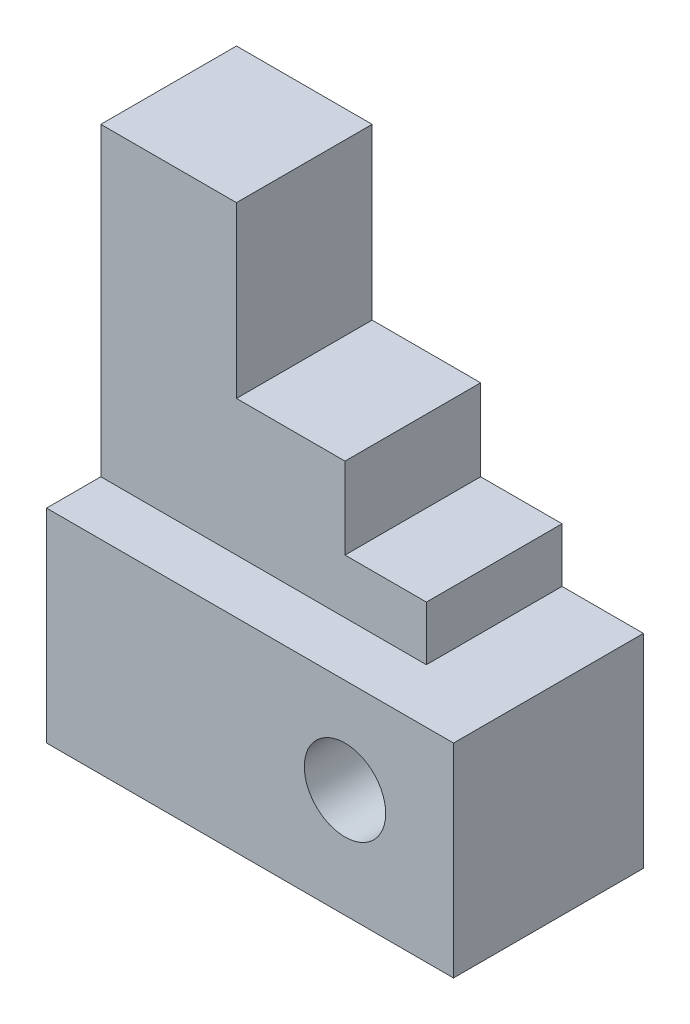
ISO-10303-21;
HEADER;
FILE_DESCRIPTION(('STEP AP214'),'2;1');
FILE_NAME('part.step','',(''),(''),'','','');
FILE_SCHEMA(('AUTOMOTIVE_DESIGN { 1 0 10303 214 1 1 1 1 }'));
ENDSEC;
DATA;
#1=APPLICATION_CONTEXT('core data for automotive mechanical design processes');
#2=APPLICATION_PROTOCOL_DEFINITION('international standard','automotive_design',2000,#1);
#3=PRODUCT_CONTEXT('',#1,'mechanical');
#4=PRODUCT('Part','Part','',(#3));
#5=PRODUCT_RELATED_PRODUCT_CATEGORY('part','',(#4));
#6=PRODUCT_DEFINITION_FORMATION('','',#4);
#7=PRODUCT_DEFINITION_CONTEXT('part definition',#1,'design');
#8=PRODUCT_DEFINITION('design','',#6,#7);
#9=PRODUCT_DEFINITION_SHAPE('','',#8);
#10=(LENGTH_UNIT() NAMED_UNIT(*) SI_UNIT(.MILLI.,.METRE.));
#11=(NAMED_UNIT(*) PLANE_ANGLE_UNIT() SI_UNIT($,.RADIAN.));
#12=(NAMED_UNIT(*) SI_UNIT($,.STERADIAN.) SOLID_ANGLE_UNIT());
#13=UNCERTAINTY_MEASURE_WITH_UNIT(LENGTH_MEASURE(1.E-05),#10,'distance_accuracy_value','');
#14=(GEOMETRIC_REPRESENTATION_CONTEXT(3) GLOBAL_UNCERTAINTY_ASSIGNED_CONTEXT((#13)) GLOBAL_UNIT_ASSIGNED_CONTEXT((#10,
#11,#12)) REPRESENTATION_CONTEXT('',''));
#15=CARTESIAN_POINT('',(0.,0.,0.));
#16=DIRECTION('',(0.,0.,1.));
#17=DIRECTION('',(1.,0.,0.));
#18=AXIS2_PLACEMENT_3D('',#15,#16,#17);
#19=CARTESIAN_POINT('',(0.,0.,0.));
#20=DIRECTION('',(0.,0.,1.));
#21=DIRECTION('',(1.,0.,0.));
#22=AXIS2_PLACEMENT_3D('',#19,#20,#21);
#23=PLANE('',#22);
#24=CARTESIAN_POINT('',(-16.,16.,0.));
#25=DIRECTION('',(0.,0.,1.));
#26=DIRECTION('',(1.,0.,0.));
#27=AXIS2_PLACEMENT_3D('',#24,#25,#26);
#28=CIRCLE('',#27,6.);
#29=CARTESIAN_POINT('',(-10.,16.,0.));
#30=VERTEX_POINT('',#29);
#31=EDGE_CURVE('E148',#30,#30,#28,.T.);
#32=ORIENTED_EDGE('',*,*,#31,.F.);
#33=EDGE_LOOP('',(#32));
#34=FACE_BOUND('',#33,.T.);
#35=DIRECTION('',(-1.,0.,0.));
#36=VECTOR('',#35,1.);
#37=CARTESIAN_POINT('',(0.,30.,0.));
#38=LINE('',#37,#36);
#39=CARTESIAN_POINT('',(0.,30.,0.));
#40=VERTEX_POINT('',#39);
#41=CARTESIAN_POINT('',(-60.,30.,0.));
#42=VERTEX_POINT('',#41);
#43=EDGE_CURVE('E158',#40,#42,#38,.T.);
#44=ORIENTED_EDGE('',*,*,#43,.T.);
#45=DIRECTION('',(0.,1.,0.));
#46=VECTOR('',#45,1.);
#47=CARTESIAN_POINT('',(-60.,0.,0.));
#48=LINE('',#47,#46);
#49=CARTESIAN_POINT('',(-60.,0.,0.));
#50=VERTEX_POINT('',#49);
#51=EDGE_CURVE('E149',#50,#42,#48,.T.);
#52=ORIENTED_EDGE('',*,*,#51,.F.);
#53=DIRECTION('',(-1.,0.,0.));
#54=VECTOR('',#53,1.);
#55=CARTESIAN_POINT('',(0.,0.,0.));
#56=LINE('',#55,#54);
#57=CARTESIAN_POINT('',(0.,0.,0.));
#58=VERTEX_POINT('',#57);
#59=EDGE_CURVE('E153',#58,#50,#56,.T.);
#60=ORIENTED_EDGE('',*,*,#59,.F.);
#61=DIRECTION('',(0.,1.,0.));
#62=VECTOR('',#61,1.);
#63=CARTESIAN_POINT('',(0.,0.,0.));
#64=LINE('',#63,#62);
#65=EDGE_CURVE('E154',#58,#40,#64,.T.);
#66=ORIENTED_EDGE('',*,*,#65,.T.);
#67=EDGE_LOOP('',(#44,#52,#60,#66));
#68=FACE_BOUND('',#67,.T.);
#69=ADVANCED_FACE('F43',(#34,#68),#23,.T.);
#70=CARTESIAN_POINT('',(-40.,0.,-28.));
#71=DIRECTION('',(1.,0.,0.));
#72=DIRECTION('',(0.,0.,-1.));
#73=AXIS2_PLACEMENT_3D('',#70,#71,#72);
#74=PLANE('',#73);
#75=DIRECTION('',(0.,0.,1.));
#76=VECTOR('',#75,1.);
#77=CARTESIAN_POINT('',(-40.,75.,-28.));
#78=LINE('',#77,#76);
#79=CARTESIAN_POINT('',(-40.,75.,-28.));
#80=VERTEX_POINT('',#79);
#81=CARTESIAN_POINT('',(-40.,75.,-8.));
#82=VERTEX_POINT('',#81);
#83=EDGE_CURVE('E55',#80,#82,#78,.T.);
#84=ORIENTED_EDGE('',*,*,#83,.T.);
#85=DIRECTION('',(0.,1.,0.));
#86=VECTOR('',#85,1.);
#87=CARTESIAN_POINT('',(-40.,0.,-8.));
#88=LINE('',#87,#86);
#89=CARTESIAN_POINT('',(-40.,50.,-8.));
#90=VERTEX_POINT('',#89);
#91=EDGE_CURVE('E129',#90,#82,#88,.T.);
#92=ORIENTED_EDGE('',*,*,#91,.F.);
#93=DIRECTION('',(0.,0.,1.));
#94=VECTOR('',#93,1.);
#95=CARTESIAN_POINT('',(-40.,50.,-28.));
#96=LINE('',#95,#94);
#97=CARTESIAN_POINT('',(-40.,50.,-28.));
#98=VERTEX_POINT('',#97);
#99=EDGE_CURVE('E122',#98,#90,#96,.T.);
#100=ORIENTED_EDGE('',*,*,#99,.F.);
#101=DIRECTION('',(0.,1.,0.));
#102=VECTOR('',#101,1.);
#103=CARTESIAN_POINT('',(-40.,0.,-28.));
#104=LINE('',#103,#102);
#105=EDGE_CURVE('E127',#98,#80,#104,.T.);
#106=ORIENTED_EDGE('',*,*,#105,.T.);
#107=EDGE_LOOP('',(#84,#92,#100,#106));
#108=FACE_BOUND('',#107,.T.);
#109=ADVANCED_FACE('F121',(#108),#74,.T.);
#110=CARTESIAN_POINT('',(0.,50.,-28.));
#111=DIRECTION('',(0.,-1.,0.));
#112=DIRECTION('',(0.,0.,-1.));
#113=AXIS2_PLACEMENT_3D('',#110,#111,#112);
#114=PLANE('',#113);
#115=DIRECTION('',(1.,0.,0.));
#116=VECTOR('',#115,1.);
#117=CARTESIAN_POINT('',(0.,50.,-8.));
#118=LINE('',#117,#116);
#119=CARTESIAN_POINT('',(-24.,50.,-8.));
#120=VERTEX_POINT('',#119);
#121=EDGE_CURVE('E239',#90,#120,#118,.T.);
#122=ORIENTED_EDGE('',*,*,#121,.T.);
#123=DIRECTION('',(0.,0.,1.));
#124=VECTOR('',#123,1.);
#125=CARTESIAN_POINT('',(-24.,50.,-28.));
#126=LINE('',#125,#124);
#127=CARTESIAN_POINT('',(-24.,50.,-28.));
#128=VERTEX_POINT('',#127);
#129=EDGE_CURVE('E135',#128,#120,#126,.T.);
#130=ORIENTED_EDGE('',*,*,#129,.F.);
#131=DIRECTION('',(1.,0.,0.));
#132=VECTOR('',#131,1.);
#133=CARTESIAN_POINT('',(0.,50.,-28.));
#134=LINE('',#133,#132);
#135=EDGE_CURVE('E134',#98,#128,#134,.T.);
#136=ORIENTED_EDGE('',*,*,#135,.F.);
#137=ORIENTED_EDGE('',*,*,#99,.T.);
#138=EDGE_LOOP('',(#122,#130,#136,#137));
#139=FACE_BOUND('',#138,.T.);
#140=ADVANCED_FACE('F137',(#139),#114,.F.);
#141=CARTESIAN_POINT('',(-24.,0.,-28.));
#142=DIRECTION('',(-1.,0.,0.));
#143=DIRECTION('',(0.,0.,1.));
#144=AXIS2_PLACEMENT_3D('',#141,#142,#143);
#145=PLANE('',#144);
#146=DIRECTION('',(0.,-1.,0.));
#147=VECTOR('',#146,1.);
#148=CARTESIAN_POINT('',(-24.,0.,-8.));
#149=LINE('',#148,#147);
#150=CARTESIAN_POINT('',(-24.,38.,-8.));
#151=VERTEX_POINT('',#150);
#152=EDGE_CURVE('E218',#120,#151,#149,.T.);
#153=ORIENTED_EDGE('',*,*,#152,.T.);
#154=DIRECTION('',(0.,0.,1.));
#155=VECTOR('',#154,1.);
#156=CARTESIAN_POINT('',(-24.,38.,-28.));
#157=LINE('',#156,#155);
#158=CARTESIAN_POINT('',(-24.,38.,-28.));
#159=VERTEX_POINT('',#158);
#160=EDGE_CURVE('E163',#159,#151,#157,.T.);
#161=ORIENTED_EDGE('',*,*,#160,.F.);
#162=DIRECTION('',(0.,-1.,0.));
#163=VECTOR('',#162,1.);
#164=CARTESIAN_POINT('',(-24.,0.,-28.));
#165=LINE('',#164,#163);
#166=EDGE_CURVE('E136',#128,#159,#165,.T.);
#167=ORIENTED_EDGE('',*,*,#166,.F.);
#168=ORIENTED_EDGE('',*,*,#129,.T.);
#169=EDGE_LOOP('',(#153,#161,#167,#168));
#170=FACE_BOUND('',#169,.T.);
#171=ADVANCED_FACE('F220',(#170),#145,.F.);
#172=CARTESIAN_POINT('',(0.,38.,-28.));
#173=DIRECTION('',(0.,-1.,0.));
#174=DIRECTION('',(0.,0.,-1.));
#175=AXIS2_PLACEMENT_3D('',#172,#173,#174);
#176=PLANE('',#175);
#177=DIRECTION('',(1.,0.,0.));
#178=VECTOR('',#177,1.);
#179=CARTESIAN_POINT('',(0.,38.,-8.));
#180=LINE('',#179,#178);
#181=CARTESIAN_POINT('',(-12.,38.,-8.));
#182=VERTEX_POINT('',#181);
#183=EDGE_CURVE('E225',#151,#182,#180,.T.);
#184=ORIENTED_EDGE('',*,*,#183,.T.);
#185=DIRECTION('',(0.,0.,1.));
#186=VECTOR('',#185,1.);
#187=CARTESIAN_POINT('',(-12.,38.,-28.));
#188=LINE('',#187,#186);
#189=CARTESIAN_POINT('',(-12.,38.,-28.));
#190=VERTEX_POINT('',#189);
#191=EDGE_CURVE('E170',#190,#182,#188,.T.);
#192=ORIENTED_EDGE('',*,*,#191,.F.);
#193=DIRECTION('',(1.,0.,0.));
#194=VECTOR('',#193,1.);
#195=CARTESIAN_POINT('',(0.,38.,-28.));
#196=LINE('',#195,#194);
#197=EDGE_CURVE('E209',#159,#190,#196,.T.);
#198=ORIENTED_EDGE('',*,*,#197,.F.);
#199=ORIENTED_EDGE('',*,*,#160,.T.);
#200=EDGE_LOOP('',(#184,#192,#198,#199));
#201=FACE_BOUND('',#200,.T.);
#202=ADVANCED_FACE('F222',(#201),#176,.F.);
#203=CARTESIAN_POINT('',(-60.,0.,-28.));
#204=DIRECTION('',(1.,0.,0.));
#205=DIRECTION('',(0.,0.,-1.));
#206=AXIS2_PLACEMENT_3D('',#203,#204,#205);
#207=PLANE('',#206);
#208=DIRECTION('',(0.,0.,1.));
#209=VECTOR('',#208,1.);
#210=CARTESIAN_POINT('',(-60.,30.,-8.));
#211=LINE('',#210,#209);
#212=CARTESIAN_POINT('',(-60.,30.,-8.));
#213=VERTEX_POINT('',#212);
#214=EDGE_CURVE('E147',#213,#42,#211,.T.);
#215=ORIENTED_EDGE('',*,*,#214,.F.);
#216=DIRECTION('',(0.,1.,0.));
#217=VECTOR('',#216,1.);
#218=CARTESIAN_POINT('',(-60.,0.,-8.));
#219=LINE('',#218,#217);
#220=CARTESIAN_POINT('',(-60.,75.,-8.));
#221=VERTEX_POINT('',#220);
#222=EDGE_CURVE('E249',#213,#221,#219,.T.);
#223=ORIENTED_EDGE('',*,*,#222,.T.);
#224=DIRECTION('',(0.,0.,1.));
#225=VECTOR('',#224,1.);
#226=CARTESIAN_POINT('',(-60.,75.,-28.));
#227=LINE('',#226,#225);
#228=CARTESIAN_POINT('',(-60.,75.,-28.));
#229=VERTEX_POINT('',#228);
#230=EDGE_CURVE('E11',#229,#221,#227,.T.);
#231=ORIENTED_EDGE('',*,*,#230,.F.);
#232=DIRECTION('',(0.,1.,0.));
#233=VECTOR('',#232,1.);
#234=CARTESIAN_POINT('',(-60.,0.,-28.));
#235=LINE('',#234,#233);
#236=CARTESIAN_POINT('',(-60.,0.,-28.));
#237=VERTEX_POINT('',#236);
#238=EDGE_CURVE('E181',#237,#229,#235,.T.);
#239=ORIENTED_EDGE('',*,*,#238,.F.);
#240=DIRECTION('',(0.,0.,1.));
#241=VECTOR('',#240,1.);
#242=CARTESIAN_POINT('',(-60.,0.,-28.));
#243=LINE('',#242,#241);
#244=EDGE_CURVE('E50',#237,#50,#243,.T.);
#245=ORIENTED_EDGE('',*,*,#244,.T.);
#246=ORIENTED_EDGE('',*,*,#51,.T.);
#247=EDGE_LOOP('',(#215,#223,#231,#239,#245,#246));
#248=FACE_BOUND('',#247,.T.);
#249=ADVANCED_FACE('F182',(#248),#207,.F.);
#250=CARTESIAN_POINT('',(0.,75.,-28.));
#251=DIRECTION('',(0.,-1.,0.));
#252=DIRECTION('',(0.,0.,-1.));
#253=AXIS2_PLACEMENT_3D('',#250,#251,#252);
#254=PLANE('',#253);
#255=ORIENTED_EDGE('',*,*,#230,.T.);
#256=DIRECTION('',(1.,0.,0.));
#257=VECTOR('',#256,1.);
#258=CARTESIAN_POINT('',(0.,75.,-8.));
#259=LINE('',#258,#257);
#260=EDGE_CURVE('E243',#221,#82,#259,.T.);
#261=ORIENTED_EDGE('',*,*,#260,.T.);
#262=ORIENTED_EDGE('',*,*,#83,.F.);
#263=DIRECTION('',(1.,0.,0.));
#264=VECTOR('',#263,1.);
#265=CARTESIAN_POINT('',(0.,75.,-28.));
#266=LINE('',#265,#264);
#267=EDGE_CURVE('E70',#229,#80,#266,.T.);
#268=ORIENTED_EDGE('',*,*,#267,.F.);
#269=EDGE_LOOP('',(#255,#261,#262,#268));
#270=FACE_BOUND('',#269,.T.);
#271=ADVANCED_FACE('F250',(#270),#254,.F.);
#272=CARTESIAN_POINT('',(-12.,0.,-28.));
#273=DIRECTION('',(1.,0.,0.));
#274=DIRECTION('',(0.,0.,-1.));
#275=AXIS2_PLACEMENT_3D('',#272,#273,#274);
#276=PLANE('',#275);
#277=DIRECTION('',(0.,1.,0.));
#278=VECTOR('',#277,1.);
#279=CARTESIAN_POINT('',(-12.,0.,-8.));
#280=LINE('',#279,#278);
#281=CARTESIAN_POINT('',(-12.,30.,-8.));
#282=VERTEX_POINT('',#281);
#283=EDGE_CURVE('E58',#282,#182,#280,.T.);
#284=ORIENTED_EDGE('',*,*,#283,.F.);
#285=DIRECTION('',(0.,0.,1.));
#286=VECTOR('',#285,1.);
#287=CARTESIAN_POINT('',(-12.,30.,-28.));
#288=LINE('',#287,#286);
#289=CARTESIAN_POINT('',(-12.,30.,-28.));
#290=VERTEX_POINT('',#289);
#291=EDGE_CURVE('E168',#290,#282,#288,.T.);
#292=ORIENTED_EDGE('',*,*,#291,.F.);
#293=DIRECTION('',(0.,1.,0.));
#294=VECTOR('',#293,1.);
#295=CARTESIAN_POINT('',(-12.,0.,-28.));
#296=LINE('',#295,#294);
#297=EDGE_CURVE('E210',#290,#190,#296,.T.);
#298=ORIENTED_EDGE('',*,*,#297,.T.);
#299=ORIENTED_EDGE('',*,*,#191,.T.);
#300=EDGE_LOOP('',(#284,#292,#298,#299));
#301=FACE_BOUND('',#300,.T.);
#302=ADVANCED_FACE('F221',(#301),#276,.T.);
#303=CARTESIAN_POINT('',(0.,30.,-28.));
#304=DIRECTION('',(0.,1.,0.));
#305=DIRECTION('',(-1.,0.,0.));
#306=AXIS2_PLACEMENT_3D('',#303,#304,#305);
#307=PLANE('',#306);
#308=ORIENTED_EDGE('',*,*,#43,.F.);
#309=DIRECTION('',(0.,0.,1.));
#310=VECTOR('',#309,1.);
#311=CARTESIAN_POINT('',(0.,30.,-28.));
#312=LINE('',#311,#310);
#313=CARTESIAN_POINT('',(0.,30.,-28.));
#314=VERTEX_POINT('',#313);
#315=EDGE_CURVE('E87',#314,#40,#312,.T.);
#316=ORIENTED_EDGE('',*,*,#315,.F.);
#317=DIRECTION('',(-1.,0.,0.));
#318=VECTOR('',#317,1.);
#319=CARTESIAN_POINT('',(0.,30.,-28.));
#320=LINE('',#319,#318);
#321=EDGE_CURVE('E204',#314,#290,#320,.T.);
#322=ORIENTED_EDGE('',*,*,#321,.T.);
#323=ORIENTED_EDGE('',*,*,#291,.T.);
#324=DIRECTION('',(-1.,0.,0.));
#325=VECTOR('',#324,1.);
#326=CARTESIAN_POINT('',(0.,30.,-8.));
#327=LINE('',#326,#325);
#328=EDGE_CURVE('E192',#282,#213,#327,.T.);
#329=ORIENTED_EDGE('',*,*,#328,.T.);
#330=ORIENTED_EDGE('',*,*,#214,.T.);
#331=EDGE_LOOP('',(#308,#316,#322,#323,#329,#330));
#332=FACE_BOUND('',#331,.T.);
#333=ADVANCED_FACE('F188',(#332),#307,.T.);
#334=CARTESIAN_POINT('',(0.,0.,-28.));
#335=DIRECTION('',(1.,0.,0.));
#336=DIRECTION('',(0.,0.,-1.));
#337=AXIS2_PLACEMENT_3D('',#334,#335,#336);
#338=PLANE('',#337);
#339=ORIENTED_EDGE('',*,*,#65,.F.);
#340=DIRECTION('',(0.,0.,1.));
#341=VECTOR('',#340,1.);
#342=CARTESIAN_POINT('',(0.,0.,-28.));
#343=LINE('',#342,#341);
#344=CARTESIAN_POINT('',(0.,0.,-28.));
#345=VERTEX_POINT('',#344);
#346=EDGE_CURVE('E172',#345,#58,#343,.T.);
#347=ORIENTED_EDGE('',*,*,#346,.F.);
#348=DIRECTION('',(0.,1.,0.));
#349=VECTOR('',#348,1.);
#350=CARTESIAN_POINT('',(0.,0.,-28.));
#351=LINE('',#350,#349);
#352=EDGE_CURVE('E205',#345,#314,#351,.T.);
#353=ORIENTED_EDGE('',*,*,#352,.T.);
#354=ORIENTED_EDGE('',*,*,#315,.T.);
#355=EDGE_LOOP('',(#339,#347,#353,#354));
#356=FACE_BOUND('',#355,.T.);
#357=ADVANCED_FACE('F279',(#356),#338,.T.);
#358=CARTESIAN_POINT('',(-16.,16.,-28.));
#359=DIRECTION('',(0.,0.,1.));
#360=DIRECTION('',(1.,0.,0.));
#361=AXIS2_PLACEMENT_3D('',#358,#359,#360);
#362=CYLINDRICAL_SURFACE('',#361,6.);
#363=CARTESIAN_POINT('',(-16.,16.,-28.));
#364=DIRECTION('',(0.,0.,1.));
#365=DIRECTION('',(1.,0.,0.));
#366=AXIS2_PLACEMENT_3D('',#363,#364,#365);
#367=CIRCLE('',#366,6.);
#368=CARTESIAN_POINT('',(-10.,16.,-28.));
#369=VERTEX_POINT('',#368);
#370=EDGE_CURVE('E159',#369,#369,#367,.T.);
#371=ORIENTED_EDGE('',*,*,#370,.F.);
#372=EDGE_LOOP('',(#371));
#373=FACE_BOUND('',#372,.T.);
#374=ORIENTED_EDGE('',*,*,#31,.T.);
#375=EDGE_LOOP('',(#374));
#376=FACE_BOUND('',#375,.T.);
#377=ADVANCED_FACE('F44',(#373,#376),#362,.F.);
#378=CARTESIAN_POINT('',(0.,0.,-28.));
#379=DIRECTION('',(0.,1.,0.));
#380=DIRECTION('',(0.,0.,1.));
#381=AXIS2_PLACEMENT_3D('',#378,#379,#380);
#382=PLANE('',#381);
#383=ORIENTED_EDGE('',*,*,#59,.T.);
#384=ORIENTED_EDGE('',*,*,#244,.F.);
#385=DIRECTION('',(-1.,0.,0.));
#386=VECTOR('',#385,1.);
#387=CARTESIAN_POINT('',(0.,0.,-28.));
#388=LINE('',#387,#386);
#389=EDGE_CURVE('E92',#345,#237,#388,.T.);
#390=ORIENTED_EDGE('',*,*,#389,.F.);
#391=ORIENTED_EDGE('',*,*,#346,.T.);
#392=EDGE_LOOP('',(#383,#384,#390,#391));
#393=FACE_BOUND('',#392,.T.);
#394=ADVANCED_FACE('F270',(#393),#382,.F.);
#395=CARTESIAN_POINT('',(0.,0.,-28.));
#396=DIRECTION('',(0.,0.,1.));
#397=DIRECTION('',(1.,0.,0.));
#398=AXIS2_PLACEMENT_3D('',#395,#396,#397);
#399=PLANE('',#398);
#400=ORIENTED_EDGE('',*,*,#370,.T.);
#401=EDGE_LOOP('',(#400));
#402=FACE_BOUND('',#401,.T.);
#403=ORIENTED_EDGE('',*,*,#238,.T.);
#404=ORIENTED_EDGE('',*,*,#267,.T.);
#405=ORIENTED_EDGE('',*,*,#105,.F.);
#406=ORIENTED_EDGE('',*,*,#135,.T.);
#407=ORIENTED_EDGE('',*,*,#166,.T.);
#408=ORIENTED_EDGE('',*,*,#197,.T.);
#409=ORIENTED_EDGE('',*,*,#297,.F.);
#410=ORIENTED_EDGE('',*,*,#321,.F.);
#411=ORIENTED_EDGE('',*,*,#352,.F.);
#412=ORIENTED_EDGE('',*,*,#389,.T.);
#413=EDGE_LOOP('',(#403,#404,#405,#406,#407,#408,#409,#410,#411,#412));
#414=FACE_BOUND('',#413,.T.);
#415=ADVANCED_FACE('F143',(#402,#414),#399,.F.);
#416=CARTESIAN_POINT('',(0.,0.,-8.));
#417=DIRECTION('',(0.,0.,1.));
#418=DIRECTION('',(1.,0.,0.));
#419=AXIS2_PLACEMENT_3D('',#416,#417,#418);
#420=PLANE('',#419);
#421=ORIENTED_EDGE('',*,*,#183,.F.);
#422=ORIENTED_EDGE('',*,*,#152,.F.);
#423=ORIENTED_EDGE('',*,*,#121,.F.);
#424=ORIENTED_EDGE('',*,*,#91,.T.);
#425=ORIENTED_EDGE('',*,*,#260,.F.);
#426=ORIENTED_EDGE('',*,*,#222,.F.);
#427=ORIENTED_EDGE('',*,*,#328,.F.);
#428=ORIENTED_EDGE('',*,*,#283,.T.);
#429=EDGE_LOOP('',(#421,#422,#423,#424,#425,#426,#427,#428));
#430=FACE_BOUND('',#429,.T.);
#431=ADVANCED_FACE('F240',(#430),#420,.T.);
#432=CLOSED_SHELL('',(#69,#109,#140,#171,#202,#249,#271,#302,#333,#357,#377,#394,#415,#431));
#433=MANIFOLD_SOLID_BREP('B2',#432);
#434=ADVANCED_BREP_SHAPE_REPRESENTATION('',(#18,#433),#14);
#435=SHAPE_DEFINITION_REPRESENTATION(#9,#434);
ENDSEC;
END-ISO-10303-21;
